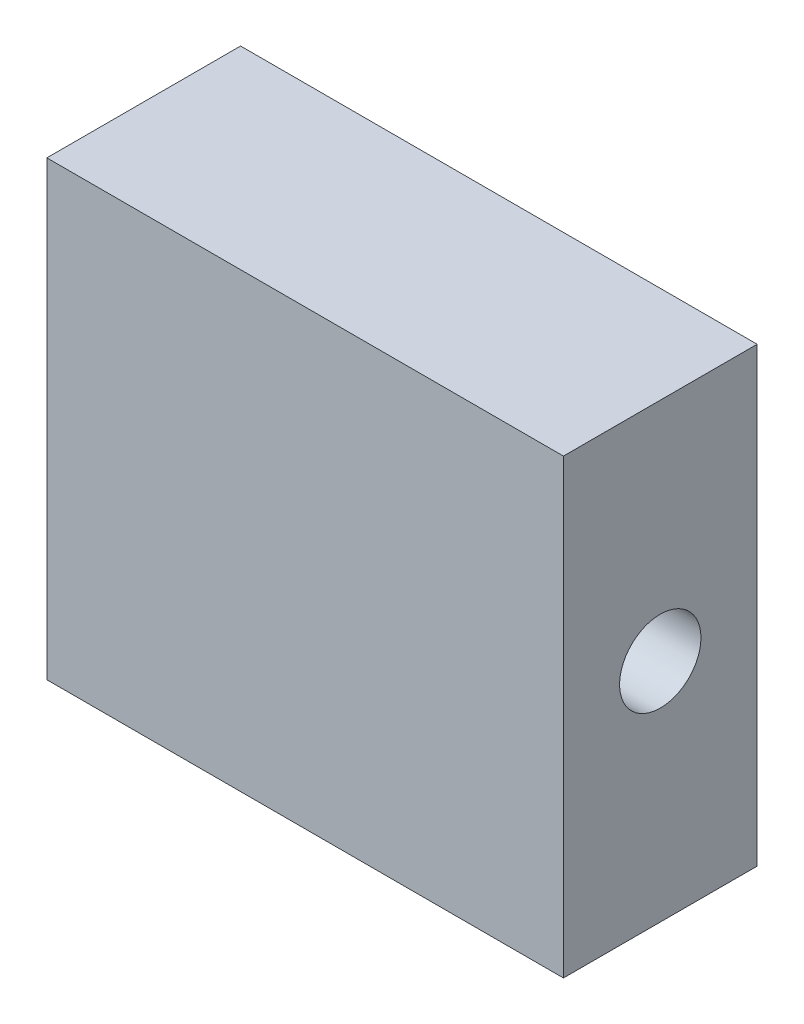
ISO-10303-21;
HEADER;
FILE_DESCRIPTION(('STEP AP214'),'2;1');
FILE_NAME('part.step','',(''),(''),'','','');
FILE_SCHEMA(('AUTOMOTIVE_DESIGN { 1 0 10303 214 1 1 1 1 }'));
ENDSEC;
DATA;
#1=APPLICATION_CONTEXT('core data for automotive mechanical design processes');
#2=APPLICATION_PROTOCOL_DEFINITION('international standard','automotive_design',2000,#1);
#3=PRODUCT_CONTEXT('',#1,'mechanical');
#4=PRODUCT('Part','Part','',(#3));
#5=PRODUCT_RELATED_PRODUCT_CATEGORY('part','',(#4));
#6=PRODUCT_DEFINITION_FORMATION('','',#4);
#7=PRODUCT_DEFINITION_CONTEXT('part definition',#1,'design');
#8=PRODUCT_DEFINITION('design','',#6,#7);
#9=PRODUCT_DEFINITION_SHAPE('','',#8);
#10=(LENGTH_UNIT() NAMED_UNIT(*) SI_UNIT(.MILLI.,.METRE.));
#11=(NAMED_UNIT(*) PLANE_ANGLE_UNIT() SI_UNIT($,.RADIAN.));
#12=(NAMED_UNIT(*) SI_UNIT($,.STERADIAN.) SOLID_ANGLE_UNIT());
#13=UNCERTAINTY_MEASURE_WITH_UNIT(LENGTH_MEASURE(1.E-05),#10,'distance_accuracy_value','');
#14=(GEOMETRIC_REPRESENTATION_CONTEXT(3) GLOBAL_UNCERTAINTY_ASSIGNED_CONTEXT((#13)) GLOBAL_UNIT_ASSIGNED_CONTEXT((#10,
#11,#12)) REPRESENTATION_CONTEXT('',''));
#15=CARTESIAN_POINT('',(0.,0.,0.));
#16=DIRECTION('',(0.,0.,1.));
#17=DIRECTION('',(1.,0.,0.));
#18=AXIS2_PLACEMENT_3D('',#15,#16,#17);
#19=CARTESIAN_POINT('',(40.,0.,0.));
#20=DIRECTION('',(1.,0.,0.));
#21=DIRECTION('',(0.,0.,-1.));
#22=AXIS2_PLACEMENT_3D('',#19,#20,#21);
#23=PLANE('',#22);
#24=DIRECTION('',(0.,1.,0.));
#25=VECTOR('',#24,1.);
#26=CARTESIAN_POINT('',(40.,17.5,-7.5));
#27=LINE('',#26,#25);
#28=CARTESIAN_POINT('',(40.,-17.5,-7.5));
#29=VERTEX_POINT('',#28);
#30=CARTESIAN_POINT('',(40.,17.5,-7.5));
#31=VERTEX_POINT('',#30);
#32=EDGE_CURVE('E89',#29,#31,#27,.T.);
#33=ORIENTED_EDGE('',*,*,#32,.T.);
#34=DIRECTION('',(0.,0.,1.));
#35=VECTOR('',#34,1.);
#36=CARTESIAN_POINT('',(40.,17.5,7.5));
#37=LINE('',#36,#35);
#38=CARTESIAN_POINT('',(40.,17.5,7.5));
#39=VERTEX_POINT('',#38);
#40=EDGE_CURVE('E84',#31,#39,#37,.T.);
#41=ORIENTED_EDGE('',*,*,#40,.T.);
#42=DIRECTION('',(0.,-1.,0.));
#43=VECTOR('',#42,1.);
#44=CARTESIAN_POINT('',(40.,17.5,7.5));
#45=LINE('',#44,#43);
#46=CARTESIAN_POINT('',(40.,-17.5,7.5));
#47=VERTEX_POINT('',#46);
#48=EDGE_CURVE('E87',#39,#47,#45,.T.);
#49=ORIENTED_EDGE('',*,*,#48,.T.);
#50=DIRECTION('',(0.,0.,-1.));
#51=VECTOR('',#50,1.);
#52=CARTESIAN_POINT('',(40.,-17.5,7.5));
#53=LINE('',#52,#51);
#54=EDGE_CURVE('E54',#47,#29,#53,.T.);
#55=ORIENTED_EDGE('',*,*,#54,.T.);
#56=EDGE_LOOP('',(#33,#41,#49,#55));
#57=FACE_BOUND('',#56,.T.);
#58=CARTESIAN_POINT('',(40.,0.,0.));
#59=DIRECTION('',(1.,0.,0.));
#60=DIRECTION('',(0.,0.,-1.));
#61=AXIS2_PLACEMENT_3D('',#58,#59,#60);
#62=CIRCLE('',#61,3.15);
#63=CARTESIAN_POINT('',(40.,0.,-3.15));
#64=VERTEX_POINT('',#63);
#65=EDGE_CURVE('E104',#64,#64,#62,.T.);
#66=ORIENTED_EDGE('',*,*,#65,.F.);
#67=EDGE_LOOP('',(#66));
#68=FACE_BOUND('',#67,.T.);
#69=ADVANCED_FACE('F37',(#57,#68),#23,.T.);
#70=CARTESIAN_POINT('',(0.,0.,0.));
#71=DIRECTION('',(1.,0.,0.));
#72=DIRECTION('',(0.,0.,-1.));
#73=AXIS2_PLACEMENT_3D('',#70,#71,#72);
#74=PLANE('',#73);
#75=DIRECTION('',(0.,1.,0.));
#76=VECTOR('',#75,1.);
#77=CARTESIAN_POINT('',(0.,17.5,-7.5));
#78=LINE('',#77,#76);
#79=CARTESIAN_POINT('',(0.,-17.5,-7.5));
#80=VERTEX_POINT('',#79);
#81=CARTESIAN_POINT('',(0.,17.5,-7.5));
#82=VERTEX_POINT('',#81);
#83=EDGE_CURVE('E101',#80,#82,#78,.T.);
#84=ORIENTED_EDGE('',*,*,#83,.F.);
#85=DIRECTION('',(0.,0.,-1.));
#86=VECTOR('',#85,1.);
#87=CARTESIAN_POINT('',(0.,-17.5,7.5));
#88=LINE('',#87,#86);
#89=CARTESIAN_POINT('',(0.,-17.5,7.5));
#90=VERTEX_POINT('',#89);
#91=EDGE_CURVE('E77',#90,#80,#88,.T.);
#92=ORIENTED_EDGE('',*,*,#91,.F.);
#93=DIRECTION('',(0.,-1.,0.));
#94=VECTOR('',#93,1.);
#95=CARTESIAN_POINT('',(0.,17.5,7.5));
#96=LINE('',#95,#94);
#97=CARTESIAN_POINT('',(0.,17.5,7.5));
#98=VERTEX_POINT('',#97);
#99=EDGE_CURVE('E71',#98,#90,#96,.T.);
#100=ORIENTED_EDGE('',*,*,#99,.F.);
#101=DIRECTION('',(0.,0.,1.));
#102=VECTOR('',#101,1.);
#103=CARTESIAN_POINT('',(0.,17.5,7.5));
#104=LINE('',#103,#102);
#105=EDGE_CURVE('E93',#82,#98,#104,.T.);
#106=ORIENTED_EDGE('',*,*,#105,.F.);
#107=EDGE_LOOP('',(#84,#92,#100,#106));
#108=FACE_BOUND('',#107,.T.);
#109=CARTESIAN_POINT('',(0.,0.,0.));
#110=DIRECTION('',(1.,0.,0.));
#111=DIRECTION('',(0.,0.,-1.));
#112=AXIS2_PLACEMENT_3D('',#109,#110,#111);
#113=CIRCLE('',#112,3.15);
#114=CARTESIAN_POINT('',(0.,0.,-3.15));
#115=VERTEX_POINT('',#114);
#116=EDGE_CURVE('E116',#115,#115,#113,.T.);
#117=ORIENTED_EDGE('',*,*,#116,.T.);
#118=EDGE_LOOP('',(#117));
#119=FACE_BOUND('',#118,.T.);
#120=ADVANCED_FACE('F112',(#108,#119),#74,.F.);
#121=CARTESIAN_POINT('',(40.,17.5,-7.5));
#122=DIRECTION('',(0.,0.,1.));
#123=DIRECTION('',(0.,-1.,0.));
#124=AXIS2_PLACEMENT_3D('',#121,#122,#123);
#125=PLANE('',#124);
#126=ORIENTED_EDGE('',*,*,#83,.T.);
#127=DIRECTION('',(-1.,0.,0.));
#128=VECTOR('',#127,1.);
#129=CARTESIAN_POINT('',(40.,17.5,-7.5));
#130=LINE('',#129,#128);
#131=EDGE_CURVE('E11',#31,#82,#130,.T.);
#132=ORIENTED_EDGE('',*,*,#131,.F.);
#133=ORIENTED_EDGE('',*,*,#32,.F.);
#134=DIRECTION('',(-1.,0.,0.));
#135=VECTOR('',#134,1.);
#136=CARTESIAN_POINT('',(40.,-17.5,-7.5));
#137=LINE('',#136,#135);
#138=EDGE_CURVE('E97',#29,#80,#137,.T.);
#139=ORIENTED_EDGE('',*,*,#138,.T.);
#140=EDGE_LOOP('',(#126,#132,#133,#139));
#141=FACE_BOUND('',#140,.T.);
#142=ADVANCED_FACE('F39',(#141),#125,.F.);
#143=CARTESIAN_POINT('',(40.,17.5,7.5));
#144=DIRECTION('',(0.,-1.,0.));
#145=DIRECTION('',(0.,0.,-1.));
#146=AXIS2_PLACEMENT_3D('',#143,#144,#145);
#147=PLANE('',#146);
#148=ORIENTED_EDGE('',*,*,#105,.T.);
#149=DIRECTION('',(-1.,0.,0.));
#150=VECTOR('',#149,1.);
#151=CARTESIAN_POINT('',(40.,17.5,7.5));
#152=LINE('',#151,#150);
#153=EDGE_CURVE('E46',#39,#98,#152,.T.);
#154=ORIENTED_EDGE('',*,*,#153,.F.);
#155=ORIENTED_EDGE('',*,*,#40,.F.);
#156=ORIENTED_EDGE('',*,*,#131,.T.);
#157=EDGE_LOOP('',(#148,#154,#155,#156));
#158=FACE_BOUND('',#157,.T.);
#159=ADVANCED_FACE('F92',(#158),#147,.F.);
#160=CARTESIAN_POINT('',(40.,17.5,7.5));
#161=DIRECTION('',(0.,0.,-1.));
#162=DIRECTION('',(0.,1.,0.));
#163=AXIS2_PLACEMENT_3D('',#160,#161,#162);
#164=PLANE('',#163);
#165=ORIENTED_EDGE('',*,*,#99,.T.);
#166=DIRECTION('',(-1.,0.,0.));
#167=VECTOR('',#166,1.);
#168=CARTESIAN_POINT('',(40.,-17.5,7.5));
#169=LINE('',#168,#167);
#170=EDGE_CURVE('E94',#47,#90,#169,.T.);
#171=ORIENTED_EDGE('',*,*,#170,.F.);
#172=ORIENTED_EDGE('',*,*,#48,.F.);
#173=ORIENTED_EDGE('',*,*,#153,.T.);
#174=EDGE_LOOP('',(#165,#171,#172,#173));
#175=FACE_BOUND('',#174,.T.);
#176=ADVANCED_FACE('F95',(#175),#164,.F.);
#177=CARTESIAN_POINT('',(40.,-17.5,7.5));
#178=DIRECTION('',(0.,1.,0.));
#179=DIRECTION('',(0.,0.,1.));
#180=AXIS2_PLACEMENT_3D('',#177,#178,#179);
#181=PLANE('',#180);
#182=ORIENTED_EDGE('',*,*,#91,.T.);
#183=ORIENTED_EDGE('',*,*,#138,.F.);
#184=ORIENTED_EDGE('',*,*,#54,.F.);
#185=ORIENTED_EDGE('',*,*,#170,.T.);
#186=EDGE_LOOP('',(#182,#183,#184,#185));
#187=FACE_BOUND('',#186,.T.);
#188=ADVANCED_FACE('F109',(#187),#181,.F.);
#189=CARTESIAN_POINT('',(40.,0.,0.));
#190=DIRECTION('',(-1.,0.,0.));
#191=DIRECTION('',(0.,0.,1.));
#192=AXIS2_PLACEMENT_3D('',#189,#190,#191);
#193=CYLINDRICAL_SURFACE('',#192,3.15);
#194=ORIENTED_EDGE('',*,*,#65,.T.);
#195=EDGE_LOOP('',(#194));
#196=FACE_BOUND('',#195,.T.);
#197=ORIENTED_EDGE('',*,*,#116,.F.);
#198=EDGE_LOOP('',(#197));
#199=FACE_BOUND('',#198,.T.);
#200=ADVANCED_FACE('F122',(#196,#199),#193,.F.);
#201=CLOSED_SHELL('',(#69,#120,#142,#159,#176,#188,#200));
#202=MANIFOLD_SOLID_BREP('B2',#201);
#203=ADVANCED_BREP_SHAPE_REPRESENTATION('',(#18,#202),#14);
#204=SHAPE_DEFINITION_REPRESENTATION(#9,#203);
ENDSEC;
END-ISO-10303-21;
